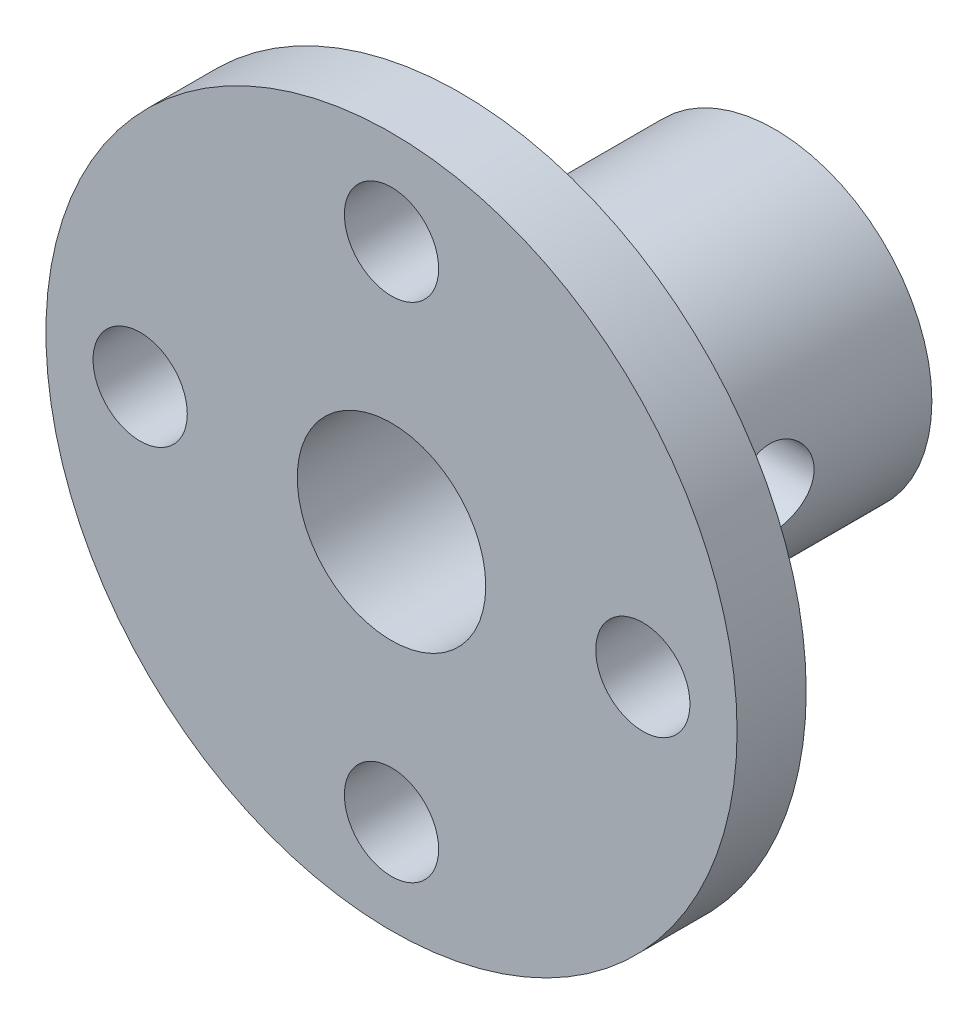
ISO-10303-21;
HEADER;
FILE_DESCRIPTION(('STEP AP214'),'2;1');
FILE_NAME('part.step','',(''),(''),'','','');
FILE_SCHEMA(('AUTOMOTIVE_DESIGN { 1 0 10303 214 1 1 1 1 }'));
ENDSEC;
DATA;
#1=APPLICATION_CONTEXT('core data for automotive mechanical design processes');
#2=APPLICATION_PROTOCOL_DEFINITION('international standard','automotive_design',2000,#1);
#3=PRODUCT_CONTEXT('',#1,'mechanical');
#4=PRODUCT('Part','Part','',(#3));
#5=PRODUCT_RELATED_PRODUCT_CATEGORY('part','',(#4));
#6=PRODUCT_DEFINITION_FORMATION('','',#4);
#7=PRODUCT_DEFINITION_CONTEXT('part definition',#1,'design');
#8=PRODUCT_DEFINITION('design','',#6,#7);
#9=PRODUCT_DEFINITION_SHAPE('','',#8);
#10=(LENGTH_UNIT() NAMED_UNIT(*) SI_UNIT(.MILLI.,.METRE.));
#11=(NAMED_UNIT(*) PLANE_ANGLE_UNIT() SI_UNIT($,.RADIAN.));
#12=(NAMED_UNIT(*) SI_UNIT($,.STERADIAN.) SOLID_ANGLE_UNIT());
#13=UNCERTAINTY_MEASURE_WITH_UNIT(LENGTH_MEASURE(1.E-05),#10,'distance_accuracy_value','');
#14=(GEOMETRIC_REPRESENTATION_CONTEXT(3) GLOBAL_UNCERTAINTY_ASSIGNED_CONTEXT((#13)) GLOBAL_UNIT_ASSIGNED_CONTEXT((#10,
#11,#12)) REPRESENTATION_CONTEXT('',''));
#15=CARTESIAN_POINT('',(0.,0.,0.));
#16=DIRECTION('',(0.,0.,1.));
#17=DIRECTION('',(1.,0.,0.));
#18=AXIS2_PLACEMENT_3D('',#15,#16,#17);
#19=CARTESIAN_POINT('',(0.,0.,10.));
#20=DIRECTION('',(0.,0.,-1.));
#21=DIRECTION('',(-1.,0.,0.));
#22=AXIS2_PLACEMENT_3D('',#19,#20,#21);
#23=CYLINDRICAL_SURFACE('',#22,3.);
#24=CARTESIAN_POINT('',(0.,0.,0.));
#25=DIRECTION('',(0.,0.,1.));
#26=DIRECTION('',(1.,0.,0.));
#27=AXIS2_PLACEMENT_3D('',#24,#25,#26);
#28=CIRCLE('',#27,3.);
#29=CARTESIAN_POINT('',(3.,0.,0.));
#30=VERTEX_POINT('',#29);
#31=EDGE_CURVE('E141',#30,#30,#28,.T.);
#32=ORIENTED_EDGE('',*,*,#31,.F.);
#33=EDGE_LOOP('',(#32));
#34=FACE_BOUND('',#33,.T.);
#35=CARTESIAN_POINT('',(0.,0.,12.2));
#36=DIRECTION('',(0.,0.,1.));
#37=DIRECTION('',(1.,0.,0.));
#38=AXIS2_PLACEMENT_3D('',#35,#36,#37);
#39=CIRCLE('',#38,3.);
#40=CARTESIAN_POINT('',(3.,0.,12.2));
#41=VERTEX_POINT('',#40);
#42=EDGE_CURVE('E114',#41,#41,#39,.T.);
#43=ORIENTED_EDGE('',*,*,#42,.T.);
#44=EDGE_LOOP('',(#43));
#45=FACE_BOUND('',#44,.T.);
#46=CARTESIAN_POINT('',(2.9,-0.768114574786862,5.9861541461658));
#47=CARTESIAN_POINT('',(2.90705269748734,-0.7414892486562,6.00689035452962));
#48=CARTESIAN_POINT('',(2.91393788552735,-0.714008792742493,6.02656357965437));
#49=CARTESIAN_POINT('',(2.92721725400898,-0.657452703931314,6.06367405390782));
#50=CARTESIAN_POINT('',(2.93361127553782,-0.628376559935395,6.08111058058374));
#51=CARTESIAN_POINT('',(2.9518288815645,-0.538889324458006,6.12991616719735));
#52=CARTESIAN_POINT('',(2.9626720207105,-0.476277719109228,6.1577357426059));
#53=CARTESIAN_POINT('',(2.9806169361919,-0.346714628327526,6.20291748030478));
#54=CARTESIAN_POINT('',(2.98770945378188,-0.279752856979955,6.22025377867061));
#55=CARTESIAN_POINT('',(2.99733283197776,-0.14364870153666,6.24363159837811));
#56=CARTESIAN_POINT('',(2.99987093311601,-0.0745099567638291,6.24969104802894));
#57=CARTESIAN_POINT('',(3.00011369311915,0.0605644428890583,6.25027209278029));
#58=CARTESIAN_POINT('',(2.99803950588453,0.126498209912587,6.24532160010615));
#59=CARTESIAN_POINT('',(2.98972003823227,0.256562679900534,6.22515696827677));
#60=CARTESIAN_POINT('',(2.98347088928361,0.320691653051645,6.20993330984592));
#61=CARTESIAN_POINT('',(2.96746349990102,0.445062818462619,6.16990284613368));
#62=CARTESIAN_POINT('',(2.95772127329742,0.505321292034968,6.14513973603338));
#63=CARTESIAN_POINT('',(2.93565089900505,0.620806791814525,6.08686285503438));
#64=CARTESIAN_POINT('',(2.92332754464297,0.676042875998879,6.05336527677288));
#65=CARTESIAN_POINT('',(2.90689594560464,0.741723387543405,6.00629250623333));
#66=CARTESIAN_POINT('',(2.9034674530915,0.755027028895179,5.99634956932653));
#67=CARTESIAN_POINT('',(2.9,0.768114574786862,5.9861541461658));
#68=B_SPLINE_CURVE_WITH_KNOTS('',3,(#46,#47,#48,#49,#50,#51,#52,#53,#54,#55,#56,#57,#58,#59,#60,
#61,#62,#63,#64,#65,#66,#67),.UNSPECIFIED.,.F.,.F.,(4,2,2,2,2,2,2,2,2,2,4),(0.,
0.103374158819023,0.206781623825313,0.413820790976077,0.621368694750286,0.828586349148681,
1.02608331799198,1.22376354235444,1.42054886253011,1.61697192894005,1.66783321400687),.UNSPECIFIED.);
#69=CARTESIAN_POINT('',(2.9,-0.768114574786862,5.9861541461658));
#70=VERTEX_POINT('',#69);
#71=CARTESIAN_POINT('',(2.9,0.768114574786862,5.9861541461658));
#72=VERTEX_POINT('',#71);
#73=EDGE_CURVE('E50',#70,#72,#68,.T.);
#74=ORIENTED_EDGE('',*,*,#73,.F.);
#75=DIRECTION('',(0.,0.,-1.));
#76=VECTOR('',#75,1.);
#77=CARTESIAN_POINT('',(2.9,-0.768114574786862,10.));
#78=LINE('',#77,#76);
#79=CARTESIAN_POINT('',(2.9,-0.768114574786862,4.0138458538342));
#80=VERTEX_POINT('',#79);
#81=EDGE_CURVE('E11',#70,#80,#78,.T.);
#82=ORIENTED_EDGE('',*,*,#81,.T.);
#83=CARTESIAN_POINT('',(2.9,0.768114574786862,4.0138458538342));
#84=CARTESIAN_POINT('',(2.90705269748734,0.7414892486562,3.99310964547038));
#85=CARTESIAN_POINT('',(2.91393788552735,0.714008792742493,3.97343642034563));
#86=CARTESIAN_POINT('',(2.92721725400898,0.657452703931314,3.93632594609218));
#87=CARTESIAN_POINT('',(2.93361127553782,0.628376559935395,3.91888941941626));
#88=CARTESIAN_POINT('',(2.9518288815645,0.538889324458006,3.87008383280265));
#89=CARTESIAN_POINT('',(2.9626720207105,0.476277719109228,3.8422642573941));
#90=CARTESIAN_POINT('',(2.9806169361919,0.346714628327526,3.79708251969522));
#91=CARTESIAN_POINT('',(2.98770945378188,0.279752856979955,3.77974622132939));
#92=CARTESIAN_POINT('',(2.99733283197776,0.14364870153666,3.75636840162189));
#93=CARTESIAN_POINT('',(2.99987093311601,0.0745099567638295,3.75030895197105));
#94=CARTESIAN_POINT('',(3.00011369311915,-0.0605644428890578,3.74972790721971));
#95=CARTESIAN_POINT('',(2.99803950588453,-0.126498209912586,3.75467839989385));
#96=CARTESIAN_POINT('',(2.98972003823227,-0.256562679900534,3.77484303172323));
#97=CARTESIAN_POINT('',(2.98347088928361,-0.320691653051645,3.79006669015408));
#98=CARTESIAN_POINT('',(2.96746349990102,-0.445062818462618,3.83009715386632));
#99=CARTESIAN_POINT('',(2.95772127329742,-0.505321292034967,3.85486026396662));
#100=CARTESIAN_POINT('',(2.93565089900505,-0.620806791814525,3.91313714496562));
#101=CARTESIAN_POINT('',(2.92332754464297,-0.676042875998879,3.94663472322712));
#102=CARTESIAN_POINT('',(2.90689594560464,-0.741723387543405,3.99370749376667));
#103=CARTESIAN_POINT('',(2.9034674530915,-0.755027028895179,4.00365043067347));
#104=CARTESIAN_POINT('',(2.9,-0.768114574786862,4.0138458538342));
#105=B_SPLINE_CURVE_WITH_KNOTS('',3,(#83,#84,#85,#86,#87,#88,#89,#90,#91,#92,#93,#94,#95,#96,
#97,#98,#99,#100,#101,#102,#103,#104),.UNSPECIFIED.,.F.,.F.,(4,2,2,2,2,2,2,2,2,2,4),(0.,
0.103374158819023,0.206781623825313,0.413820790976077,0.621368694750286,0.82858634914868,
1.02608331799198,1.22376354235444,1.42054886253011,1.61697192894005,1.66783321400687),.UNSPECIFIED.);
#106=CARTESIAN_POINT('',(2.9,0.768114574786862,4.0138458538342));
#107=VERTEX_POINT('',#106);
#108=EDGE_CURVE('E63',#107,#80,#105,.T.);
#109=ORIENTED_EDGE('',*,*,#108,.F.);
#110=DIRECTION('',(0.,0.,-1.));
#111=VECTOR('',#110,1.);
#112=CARTESIAN_POINT('',(2.9,0.768114574786862,10.));
#113=LINE('',#112,#111);
#114=EDGE_CURVE('E70',#107,#72,#113,.F.);
#115=ORIENTED_EDGE('',*,*,#114,.T.);
#116=EDGE_LOOP('',(#74,#82,#109,#115));
#117=FACE_BOUND('',#116,.T.);
#118=ADVANCED_FACE('F41',(#34,#45,#117),#23,.F.);
#119=CARTESIAN_POINT('',(0.,0.,0.));
#120=DIRECTION('',(0.,0.,1.));
#121=DIRECTION('',(1.,0.,0.));
#122=AXIS2_PLACEMENT_3D('',#119,#120,#121);
#123=PLANE('',#122);
#124=CARTESIAN_POINT('',(0.,0.,0.));
#125=DIRECTION('',(0.,0.,1.));
#126=DIRECTION('',(1.,0.,0.));
#127=AXIS2_PLACEMENT_3D('',#124,#125,#126);
#128=CIRCLE('',#127,5.);
#129=CARTESIAN_POINT('',(5.,0.,0.));
#130=VERTEX_POINT('',#129);
#131=EDGE_CURVE('E146',#130,#130,#128,.T.);
#132=ORIENTED_EDGE('',*,*,#131,.F.);
#133=EDGE_LOOP('',(#132));
#134=FACE_BOUND('',#133,.T.);
#135=ORIENTED_EDGE('',*,*,#31,.T.);
#136=EDGE_LOOP('',(#135));
#137=FACE_BOUND('',#136,.T.);
#138=ADVANCED_FACE('F152',(#134,#137),#123,.F.);
#139=CARTESIAN_POINT('',(0.,0.,10.));
#140=DIRECTION('',(0.,0.,-1.));
#141=DIRECTION('',(-1.,0.,0.));
#142=AXIS2_PLACEMENT_3D('',#139,#140,#141);
#143=CYLINDRICAL_SURFACE('',#142,5.);
#144=CARTESIAN_POINT('',(5.,0.,3.75));
#145=CARTESIAN_POINT('',(4.99999883223344,-0.0690634072247759,3.75000193811513));
#146=CARTESIAN_POINT('',(4.99855481776523,-0.138148464858969,3.75574295897816));
#147=CARTESIAN_POINT('',(4.99293428191577,-0.274338603142111,3.7785209594225));
#148=CARTESIAN_POINT('',(4.98875621183307,-0.341442539058949,3.79556434128154));
#149=CARTESIAN_POINT('',(4.97813021943366,-0.471684060152148,3.84036604455174));
#150=CARTESIAN_POINT('',(4.97168502368406,-0.534826302858336,3.8681114989294));
#151=CARTESIAN_POINT('',(4.95721119839661,-0.655560109920355,3.93348449170403));
#152=CARTESIAN_POINT('',(4.94918251545042,-0.713151486957299,3.97111236343245));
#153=CARTESIAN_POINT('',(4.93222844659834,-0.822334939417433,4.05600065804518));
#154=CARTESIAN_POINT('',(4.92328922623777,-0.873796408384226,4.10342631246598));
#155=CARTESIAN_POINT('',(4.90561350097941,-0.968124106002753,4.20621017075743));
#156=CARTESIAN_POINT('',(4.89687701906957,-1.01098936412428,4.26156926912208));
#157=CARTESIAN_POINT('',(4.88045646416425,-1.08752211899919,4.37966268894786));
#158=CARTESIAN_POINT('',(4.87278995392171,-1.12104351327113,4.44249435900867));
#159=CARTESIAN_POINT('',(4.85957912343519,-1.17699742379211,4.57312367638197));
#160=CARTESIAN_POINT('',(4.85403446393991,-1.19943171286611,4.64092052777147));
#161=CARTESIAN_POINT('',(4.84583730597959,-1.23212903067024,4.7781195818354));
#162=CARTESIAN_POINT('',(4.84312909229522,-1.24262689027778,4.84746241337483));
#163=CARTESIAN_POINT('',(4.84074468781451,-1.25188481255654,4.98697380751165));
#164=CARTESIAN_POINT('',(4.8410680037387,-1.25064678484831,5.05714223391551));
#165=CARTESIAN_POINT('',(4.84466004580515,-1.2366554371994,5.1945131731204));
#166=CARTESIAN_POINT('',(4.84785719168233,-1.22418195015877,5.26174635122091));
#167=CARTESIAN_POINT('',(4.85672258063736,-1.18852015575259,5.39313420909274));
#168=CARTESIAN_POINT('',(4.8623909997558,-1.16533108505785,5.45728866919082));
#169=CARTESIAN_POINT('',(4.87562594920155,-1.10865789828096,5.58144834687672));
#170=CARTESIAN_POINT('',(4.88321106224518,-1.07507222269409,5.64140514315796));
#171=CARTESIAN_POINT('',(4.89941425705322,-0.998630230012462,5.7549322581307));
#172=CARTESIAN_POINT('',(4.90803251945613,-0.955772290674032,5.80850145672271));
#173=CARTESIAN_POINT('',(4.92563233783151,-0.860552853901015,5.909336346412));
#174=CARTESIAN_POINT('',(4.93461724564976,-0.807955215138216,5.95637874171779));
#175=CARTESIAN_POINT('',(4.95171637982321,-0.695509931253083,6.04101770205325));
#176=CARTESIAN_POINT('',(4.95983057957846,-0.63566206475662,6.07861397855297));
#177=CARTESIAN_POINT('',(4.97431443411819,-0.51009657390116,6.14337548852032));
#178=CARTESIAN_POINT('',(4.98067800106438,-0.44435949434052,6.17050445021202));
#179=CARTESIAN_POINT('',(4.99089930826182,-0.309063340119069,6.21326442142465));
#180=CARTESIAN_POINT('',(4.99475752782734,-0.239504999292071,6.22889763034845));
#181=CARTESIAN_POINT('',(4.99946249392812,-0.100449975325022,6.24788130463237));
#182=CARTESIAN_POINT('',(5.00038377923565,-0.0309972666568411,6.25153585506275));
#183=CARTESIAN_POINT('',(4.99932337345376,0.107527395667924,6.24729249828709));
#184=CARTESIAN_POINT('',(4.99734194368205,0.176599383037163,6.23939563100072));
#185=CARTESIAN_POINT('',(4.99074650939464,0.31134522398041,6.21252424300718));
#186=CARTESIAN_POINT('',(4.98617195154843,0.377054265807295,6.19371561376918));
#187=CARTESIAN_POINT('',(4.97490588861778,0.504381077043759,6.14574409664296));
#188=CARTESIAN_POINT('',(4.9682141697491,0.565998432527196,6.11658016307236));
#189=CARTESIAN_POINT('',(4.95327756605259,0.684602612024873,6.04813655927106));
#190=CARTESIAN_POINT('',(4.94500722805777,0.741487868196526,6.0086865730027));
#191=CARTESIAN_POINT('',(4.92787090989516,0.847938844702705,5.92100840933586));
#192=CARTESIAN_POINT('',(4.91900482709754,0.897503299144173,5.87277871698591));
#193=CARTESIAN_POINT('',(4.90140797467309,0.989158806727276,5.76749836596295));
#194=CARTESIAN_POINT('',(4.89268586822734,1.03103655635169,5.71026024749798));
#195=CARTESIAN_POINT('',(4.87660731981032,1.10459229917725,5.58938947127857));
#196=CARTESIAN_POINT('',(4.86925081722522,1.13627074513161,5.52575709753354));
#197=CARTESIAN_POINT('',(4.85681745612221,1.18829285050774,5.39424523132243));
#198=CARTESIAN_POINT('',(4.85172712743255,1.20870366387839,5.32639364304666));
#199=CARTESIAN_POINT('',(4.84438953408486,1.23778804996148,5.18807530175908));
#200=CARTESIAN_POINT('',(4.84214164766613,1.24646418956555,5.11760912413959));
#201=CARTESIAN_POINT('',(4.84079084336631,1.25169882527833,4.97823248012066));
#202=CARTESIAN_POINT('',(4.8415994394022,1.2485982481501,4.90933547072939));
#203=CARTESIAN_POINT('',(4.84606590839869,1.23114773192739,4.77308009277668));
#204=CARTESIAN_POINT('',(4.84972372409881,1.21679801890564,4.70572169332196));
#205=CARTESIAN_POINT('',(4.85942717235602,1.17744276620233,4.57482628411216));
#206=CARTESIAN_POINT('',(4.86545846030258,1.15250117056698,4.51126891229983));
#207=CARTESIAN_POINT('',(4.8792312977069,1.09272076133756,4.38919551440526));
#208=CARTESIAN_POINT('',(4.88697308433977,1.05788057502849,4.3306801890109));
#209=CARTESIAN_POINT('',(4.90354695219593,0.97822312386428,4.21870447583165));
#210=CARTESIAN_POINT('',(4.91240220693131,0.933169302426878,4.1654157721467));
#211=CARTESIAN_POINT('',(4.93006689371905,0.834824475991446,4.06704412933716));
#212=CARTESIAN_POINT('',(4.93887631439216,0.781531517717622,4.02196314157253));
#213=CARTESIAN_POINT('',(4.95564713039719,0.667056322252159,3.94049057619616));
#214=CARTESIAN_POINT('',(4.9635902780489,0.605748685263656,3.90427115527368));
#215=CARTESIAN_POINT('',(4.97754104145932,0.477721716258731,3.84271044754956));
#216=CARTESIAN_POINT('',(4.98355004333151,0.41100630286395,3.81736136612622));
#217=CARTESIAN_POINT('',(4.99206716304618,0.28700854436956,3.78202347472529));
#218=CARTESIAN_POINT('',(4.99502154210576,0.230316809090058,3.77004063078881));
#219=CARTESIAN_POINT('',(4.9989883769329,0.11575505961357,3.75402838031505));
#220=CARTESIAN_POINT('',(5.00000097875745,0.0578851343688471,3.74999837557892));
#221=CARTESIAN_POINT('',(5.,0.,3.75));
#222=B_SPLINE_CURVE_WITH_KNOTS('',3,(#144,#145,#146,#147,#148,#149,#150,#151,#152,#153,#154,
#155,#156,#157,#158,#159,#160,#161,#162,#163,#164,#165,#166,#167,#168,#169,#170,#171,#172,#173,
#174,#175,#176,#177,#178,#179,#180,#181,#182,#183,#184,#185,#186,#187,#188,#189,#190,#191,#192,
#193,#194,#195,#196,#197,#198,#199,#200,#201,#202,#203,#204,#205,#206,#207,#208,#209,#210,#211,
#212,#213,#214,#215,#216,#217,#218,#219,#220,#221),.UNSPECIFIED.,.T.,.F.,(4,2,2,2,2,2,2,2,2,2,2,
2,2,2,2,2,2,2,2,2,2,2,2,2,2,2,2,2,2,2,2,2,2,2,2,2,2,2,4),(0.,0.206978093726575,
0.414073531469916,0.620920751905088,0.827774950141106,1.03845362864282,1.24915607983385,
1.46298872954839,1.6767871764114,1.88630245916192,2.09578365093914,2.30018747505848,
2.50460586221699,2.71108773228233,2.91760575696802,3.13001250807516,3.34242574631872,
3.55556857507595,3.76867061407202,3.97631924124397,4.18394917593952,4.38850228761698,
4.59307606101909,4.80127989637793,5.00951969173349,5.2228709100373,5.4362126562459,
5.6482687884503,5.8602785271034,6.06619816998844,6.27211367463362,6.47680333799539,
6.68152140114085,6.89157980341592,7.10168808142015,7.3156015458299,7.52936136517792,
7.70285202451791,7.876329633692),.UNSPECIFIED.);
#223=CARTESIAN_POINT('',(5.,0.,3.75));
#224=VERTEX_POINT('',#223);
#225=EDGE_CURVE('E78',#224,#224,#222,.T.);
#226=ORIENTED_EDGE('',*,*,#225,.T.);
#227=EDGE_LOOP('',(#226));
#228=FACE_BOUND('',#227,.T.);
#229=CARTESIAN_POINT('',(0.,0.,10.));
#230=DIRECTION('',(0.,0.,1.));
#231=DIRECTION('',(1.,0.,0.));
#232=AXIS2_PLACEMENT_3D('',#229,#230,#231);
#233=CIRCLE('',#232,5.);
#234=CARTESIAN_POINT('',(5.,0.,10.));
#235=VERTEX_POINT('',#234);
#236=EDGE_CURVE('E74',#235,#235,#233,.T.);
#237=ORIENTED_EDGE('',*,*,#236,.F.);
#238=EDGE_LOOP('',(#237));
#239=FACE_BOUND('',#238,.T.);
#240=ORIENTED_EDGE('',*,*,#131,.T.);
#241=EDGE_LOOP('',(#240));
#242=FACE_BOUND('',#241,.T.);
#243=ADVANCED_FACE('F43',(#228,#239,#242),#143,.T.);
#244=CARTESIAN_POINT('',(0.,0.,12.2));
#245=DIRECTION('',(0.,0.,1.));
#246=DIRECTION('',(1.,0.,0.));
#247=AXIS2_PLACEMENT_3D('',#244,#245,#246);
#248=PLANE('',#247);
#249=CARTESIAN_POINT('',(8.,0.,12.2));
#250=DIRECTION('',(0.,0.,1.));
#251=DIRECTION('',(1.,0.,0.));
#252=AXIS2_PLACEMENT_3D('',#249,#250,#251);
#253=CIRCLE('',#252,1.5);
#254=CARTESIAN_POINT('',(9.5,0.,12.2));
#255=VERTEX_POINT('',#254);
#256=EDGE_CURVE('E115',#255,#255,#253,.T.);
#257=ORIENTED_EDGE('',*,*,#256,.F.);
#258=EDGE_LOOP('',(#257));
#259=FACE_BOUND('',#258,.T.);
#260=CARTESIAN_POINT('',(0.,8.,12.2));
#261=DIRECTION('',(0.,0.,1.));
#262=DIRECTION('',(1.,0.,0.));
#263=AXIS2_PLACEMENT_3D('',#260,#261,#262);
#264=CIRCLE('',#263,1.5);
#265=CARTESIAN_POINT('',(1.5,8.,12.2));
#266=VERTEX_POINT('',#265);
#267=EDGE_CURVE('E118',#266,#266,#264,.T.);
#268=ORIENTED_EDGE('',*,*,#267,.F.);
#269=EDGE_LOOP('',(#268));
#270=FACE_BOUND('',#269,.T.);
#271=CARTESIAN_POINT('',(-8.,0.,12.2));
#272=DIRECTION('',(0.,0.,1.));
#273=DIRECTION('',(1.,0.,0.));
#274=AXIS2_PLACEMENT_3D('',#271,#272,#273);
#275=CIRCLE('',#274,1.5);
#276=CARTESIAN_POINT('',(-6.5,0.,12.2));
#277=VERTEX_POINT('',#276);
#278=EDGE_CURVE('E124',#277,#277,#275,.T.);
#279=ORIENTED_EDGE('',*,*,#278,.F.);
#280=EDGE_LOOP('',(#279));
#281=FACE_BOUND('',#280,.T.);
#282=CARTESIAN_POINT('',(0.,-8.,12.2));
#283=DIRECTION('',(0.,0.,1.));
#284=DIRECTION('',(1.,0.,0.));
#285=AXIS2_PLACEMENT_3D('',#282,#283,#284);
#286=CIRCLE('',#285,1.5);
#287=CARTESIAN_POINT('',(1.5,-8.,12.2));
#288=VERTEX_POINT('',#287);
#289=EDGE_CURVE('E130',#288,#288,#286,.T.);
#290=ORIENTED_EDGE('',*,*,#289,.F.);
#291=EDGE_LOOP('',(#290));
#292=FACE_BOUND('',#291,.T.);
#293=CARTESIAN_POINT('',(0.,0.,12.2));
#294=DIRECTION('',(0.,0.,1.));
#295=DIRECTION('',(1.,0.,0.));
#296=AXIS2_PLACEMENT_3D('',#293,#294,#295);
#297=CIRCLE('',#296,11.);
#298=CARTESIAN_POINT('',(11.,0.,12.2));
#299=VERTEX_POINT('',#298);
#300=EDGE_CURVE('E138',#299,#299,#297,.T.);
#301=ORIENTED_EDGE('',*,*,#300,.T.);
#302=EDGE_LOOP('',(#301));
#303=FACE_BOUND('',#302,.T.);
#304=ORIENTED_EDGE('',*,*,#42,.F.);
#305=EDGE_LOOP('',(#304));
#306=FACE_BOUND('',#305,.T.);
#307=ADVANCED_FACE('F161',(#259,#270,#281,#292,#303,#306),#248,.T.);
#308=CARTESIAN_POINT('',(0.,0.,10.));
#309=DIRECTION('',(0.,0.,1.));
#310=DIRECTION('',(1.,0.,0.));
#311=AXIS2_PLACEMENT_3D('',#308,#309,#310);
#312=PLANE('',#311);
#313=CARTESIAN_POINT('',(8.,0.,10.));
#314=DIRECTION('',(0.,0.,1.));
#315=DIRECTION('',(1.,0.,0.));
#316=AXIS2_PLACEMENT_3D('',#313,#314,#315);
#317=CIRCLE('',#316,1.5);
#318=CARTESIAN_POINT('',(9.5,0.,10.));
#319=VERTEX_POINT('',#318);
#320=EDGE_CURVE('E111',#319,#319,#317,.T.);
#321=ORIENTED_EDGE('',*,*,#320,.T.);
#322=EDGE_LOOP('',(#321));
#323=FACE_BOUND('',#322,.T.);
#324=CARTESIAN_POINT('',(0.,8.,10.));
#325=DIRECTION('',(0.,0.,1.));
#326=DIRECTION('',(1.,0.,0.));
#327=AXIS2_PLACEMENT_3D('',#324,#325,#326);
#328=CIRCLE('',#327,1.5);
#329=CARTESIAN_POINT('',(1.5,8.,10.));
#330=VERTEX_POINT('',#329);
#331=EDGE_CURVE('E121',#330,#330,#328,.T.);
#332=ORIENTED_EDGE('',*,*,#331,.T.);
#333=EDGE_LOOP('',(#332));
#334=FACE_BOUND('',#333,.T.);
#335=CARTESIAN_POINT('',(-8.,0.,10.));
#336=DIRECTION('',(0.,0.,1.));
#337=DIRECTION('',(1.,0.,0.));
#338=AXIS2_PLACEMENT_3D('',#335,#336,#337);
#339=CIRCLE('',#338,1.5);
#340=CARTESIAN_POINT('',(-6.5,0.,10.));
#341=VERTEX_POINT('',#340);
#342=EDGE_CURVE('E127',#341,#341,#339,.T.);
#343=ORIENTED_EDGE('',*,*,#342,.T.);
#344=EDGE_LOOP('',(#343));
#345=FACE_BOUND('',#344,.T.);
#346=CARTESIAN_POINT('',(0.,-8.,10.));
#347=DIRECTION('',(0.,0.,1.));
#348=DIRECTION('',(1.,0.,0.));
#349=AXIS2_PLACEMENT_3D('',#346,#347,#348);
#350=CIRCLE('',#349,1.5);
#351=CARTESIAN_POINT('',(1.5,-8.,10.));
#352=VERTEX_POINT('',#351);
#353=EDGE_CURVE('E110',#352,#352,#350,.T.);
#354=ORIENTED_EDGE('',*,*,#353,.T.);
#355=EDGE_LOOP('',(#354));
#356=FACE_BOUND('',#355,.T.);
#357=ORIENTED_EDGE('',*,*,#236,.T.);
#358=EDGE_LOOP('',(#357));
#359=FACE_BOUND('',#358,.T.);
#360=CARTESIAN_POINT('',(0.,0.,10.));
#361=DIRECTION('',(0.,0.,1.));
#362=DIRECTION('',(1.,0.,0.));
#363=AXIS2_PLACEMENT_3D('',#360,#361,#362);
#364=CIRCLE('',#363,11.);
#365=CARTESIAN_POINT('',(11.,0.,10.));
#366=VERTEX_POINT('',#365);
#367=EDGE_CURVE('E137',#366,#366,#364,.T.);
#368=ORIENTED_EDGE('',*,*,#367,.F.);
#369=EDGE_LOOP('',(#368));
#370=FACE_BOUND('',#369,.T.);
#371=ADVANCED_FACE('F163',(#323,#334,#345,#356,#359,#370),#312,.F.);
#372=CARTESIAN_POINT('',(0.,0.,12.2));
#373=DIRECTION('',(0.,0.,-1.));
#374=DIRECTION('',(-1.,0.,0.));
#375=AXIS2_PLACEMENT_3D('',#372,#373,#374);
#376=CYLINDRICAL_SURFACE('',#375,11.);
#377=ORIENTED_EDGE('',*,*,#300,.F.);
#378=EDGE_LOOP('',(#377));
#379=FACE_BOUND('',#378,.T.);
#380=ORIENTED_EDGE('',*,*,#367,.T.);
#381=EDGE_LOOP('',(#380));
#382=FACE_BOUND('',#381,.T.);
#383=ADVANCED_FACE('F170',(#379,#382),#376,.T.);
#384=CARTESIAN_POINT('',(0.,-8.,10.));
#385=DIRECTION('',(0.,0.,1.));
#386=DIRECTION('',(1.,0.,0.));
#387=AXIS2_PLACEMENT_3D('',#384,#385,#386);
#388=CYLINDRICAL_SURFACE('',#387,1.5);
#389=ORIENTED_EDGE('',*,*,#353,.F.);
#390=EDGE_LOOP('',(#389));
#391=FACE_BOUND('',#390,.T.);
#392=ORIENTED_EDGE('',*,*,#289,.T.);
#393=EDGE_LOOP('',(#392));
#394=FACE_BOUND('',#393,.T.);
#395=ADVANCED_FACE('F178',(#391,#394),#388,.F.);
#396=CARTESIAN_POINT('',(-8.,0.,10.));
#397=DIRECTION('',(0.,0.,1.));
#398=DIRECTION('',(1.,0.,0.));
#399=AXIS2_PLACEMENT_3D('',#396,#397,#398);
#400=CYLINDRICAL_SURFACE('',#399,1.5);
#401=ORIENTED_EDGE('',*,*,#342,.F.);
#402=EDGE_LOOP('',(#401));
#403=FACE_BOUND('',#402,.T.);
#404=ORIENTED_EDGE('',*,*,#278,.T.);
#405=EDGE_LOOP('',(#404));
#406=FACE_BOUND('',#405,.T.);
#407=ADVANCED_FACE('F184',(#403,#406),#400,.F.);
#408=CARTESIAN_POINT('',(0.,8.,10.));
#409=DIRECTION('',(0.,0.,1.));
#410=DIRECTION('',(1.,0.,0.));
#411=AXIS2_PLACEMENT_3D('',#408,#409,#410);
#412=CYLINDRICAL_SURFACE('',#411,1.5);
#413=ORIENTED_EDGE('',*,*,#331,.F.);
#414=EDGE_LOOP('',(#413));
#415=FACE_BOUND('',#414,.T.);
#416=ORIENTED_EDGE('',*,*,#267,.T.);
#417=EDGE_LOOP('',(#416));
#418=FACE_BOUND('',#417,.T.);
#419=ADVANCED_FACE('F194',(#415,#418),#412,.F.);
#420=CARTESIAN_POINT('',(8.,0.,10.));
#421=DIRECTION('',(0.,0.,1.));
#422=DIRECTION('',(1.,0.,0.));
#423=AXIS2_PLACEMENT_3D('',#420,#421,#422);
#424=CYLINDRICAL_SURFACE('',#423,1.5);
#425=ORIENTED_EDGE('',*,*,#320,.F.);
#426=EDGE_LOOP('',(#425));
#427=FACE_BOUND('',#426,.T.);
#428=ORIENTED_EDGE('',*,*,#256,.T.);
#429=EDGE_LOOP('',(#428));
#430=FACE_BOUND('',#429,.T.);
#431=ADVANCED_FACE('F100',(#427,#430),#424,.F.);
#432=CARTESIAN_POINT('',(2.9,0.,5.));
#433=DIRECTION('',(1.,0.,0.));
#434=DIRECTION('',(0.,0.,-1.));
#435=AXIS2_PLACEMENT_3D('',#432,#433,#434);
#436=CYLINDRICAL_SURFACE('',#435,1.25);
#437=ORIENTED_EDGE('',*,*,#73,.T.);
#438=CARTESIAN_POINT('',(2.9,0.,5.));
#439=DIRECTION('',(1.,0.,0.));
#440=DIRECTION('',(0.,0.,-1.));
#441=AXIS2_PLACEMENT_3D('',#438,#439,#440);
#442=CIRCLE('',#441,1.25);
#443=EDGE_CURVE('E56',#107,#72,#442,.T.);
#444=ORIENTED_EDGE('',*,*,#443,.F.);
#445=ORIENTED_EDGE('',*,*,#108,.T.);
#446=EDGE_CURVE('E79',#70,#80,#442,.T.);
#447=ORIENTED_EDGE('',*,*,#446,.F.);
#448=EDGE_LOOP('',(#437,#444,#445,#447));
#449=FACE_BOUND('',#448,.T.);
#450=ORIENTED_EDGE('',*,*,#225,.F.);
#451=EDGE_LOOP('',(#450));
#452=FACE_BOUND('',#451,.T.);
#453=ADVANCED_FACE('F76',(#449,#452),#436,.F.);
#454=CARTESIAN_POINT('',(2.9,0.,5.));
#455=DIRECTION('',(1.,0.,0.));
#456=DIRECTION('',(0.,0.,-1.));
#457=AXIS2_PLACEMENT_3D('',#454,#455,#456);
#458=PLANE('',#457);
#459=ORIENTED_EDGE('',*,*,#446,.T.);
#460=ORIENTED_EDGE('',*,*,#81,.F.);
#461=EDGE_LOOP('',(#459,#460));
#462=FACE_BOUND('',#461,.T.);
#463=ADVANCED_FACE('F99',(#462),#458,.T.);
#464=ORIENTED_EDGE('',*,*,#443,.T.);
#465=ORIENTED_EDGE('',*,*,#114,.F.);
#466=EDGE_LOOP('',(#464,#465));
#467=FACE_BOUND('',#466,.T.);
#468=ADVANCED_FACE('F71',(#467),#458,.T.);
#469=CLOSED_SHELL('',(#118,#138,#243,#307,#371,#383,#395,#407,#419,#431,#453,#463,#468));
#470=MANIFOLD_SOLID_BREP('B2',#469);
#471=ADVANCED_BREP_SHAPE_REPRESENTATION('',(#18,#470),#14);
#472=SHAPE_DEFINITION_REPRESENTATION(#9,#471);
ENDSEC;
END-ISO-10303-21;
